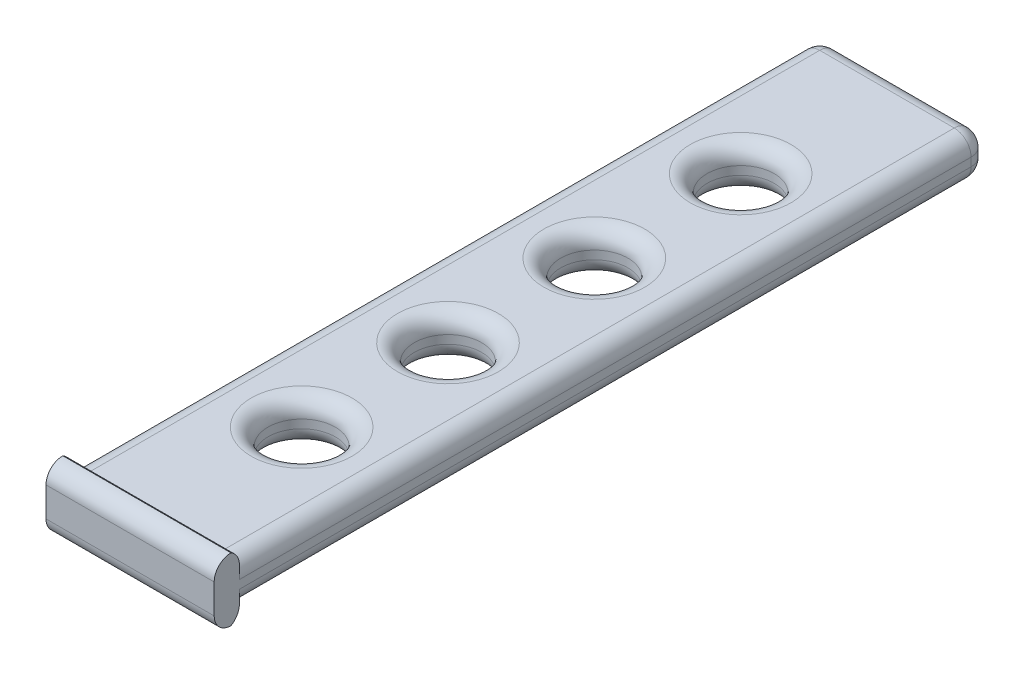
ISO-10303-21;
HEADER;
FILE_DESCRIPTION(('STEP AP214'),'2;1');
FILE_NAME('part.step','',(''),(''),'','','');
FILE_SCHEMA(('AUTOMOTIVE_DESIGN { 1 0 10303 214 1 1 1 1 }'));
ENDSEC;
DATA;
#1=APPLICATION_CONTEXT('core data for automotive mechanical design processes');
#2=APPLICATION_PROTOCOL_DEFINITION('international standard','automotive_design',2000,#1);
#3=PRODUCT_CONTEXT('',#1,'mechanical');
#4=PRODUCT('Part','Part','',(#3));
#5=PRODUCT_RELATED_PRODUCT_CATEGORY('part','',(#4));
#6=PRODUCT_DEFINITION_FORMATION('','',#4);
#7=PRODUCT_DEFINITION_CONTEXT('part definition',#1,'design');
#8=PRODUCT_DEFINITION('design','',#6,#7);
#9=PRODUCT_DEFINITION_SHAPE('','',#8);
#10=(LENGTH_UNIT() NAMED_UNIT(*) SI_UNIT(.MILLI.,.METRE.));
#11=(NAMED_UNIT(*) PLANE_ANGLE_UNIT() SI_UNIT($,.RADIAN.));
#12=(NAMED_UNIT(*) SI_UNIT($,.STERADIAN.) SOLID_ANGLE_UNIT());
#13=UNCERTAINTY_MEASURE_WITH_UNIT(LENGTH_MEASURE(1.E-05),#10,'distance_accuracy_value','');
#14=(GEOMETRIC_REPRESENTATION_CONTEXT(3) GLOBAL_UNCERTAINTY_ASSIGNED_CONTEXT((#13)) GLOBAL_UNIT_ASSIGNED_CONTEXT((#10,
#11,#12)) REPRESENTATION_CONTEXT('',''));
#15=CARTESIAN_POINT('',(0.,0.,0.));
#16=DIRECTION('',(0.,0.,1.));
#17=DIRECTION('',(1.,0.,0.));
#18=AXIS2_PLACEMENT_3D('',#15,#16,#17);
#19=CARTESIAN_POINT('',(0.,0.,0.));
#20=DIRECTION('',(0.,0.,1.));
#21=DIRECTION('',(1.,0.,0.));
#22=AXIS2_PLACEMENT_3D('',#19,#20,#21);
#23=PLANE('',#22);
#24=DIRECTION('',(0.,-1.,0.));
#25=VECTOR('',#24,1.);
#26=CARTESIAN_POINT('',(-12.7,7.93749999999999,0.));
#27=LINE('',#26,#25);
#28=CARTESIAN_POINT('',(-12.7,5.73779547438752,0.));
#29=VERTEX_POINT('',#28);
#30=CARTESIAN_POINT('',(-12.7,3.80999999999998,0.));
#31=VERTEX_POINT('',#30);
#32=EDGE_CURVE('E359',#29,#31,#27,.T.);
#33=ORIENTED_EDGE('',*,*,#32,.F.);
#34=DIRECTION('',(1.,0.,0.));
#35=VECTOR('',#34,1.);
#36=CARTESIAN_POINT('',(0.,5.73779547438752,0.));
#37=LINE('',#36,#35);
#38=CARTESIAN_POINT('',(-11.8138454005532,5.73779547438752,0.));
#39=VERTEX_POINT('',#38);
#40=EDGE_CURVE('E198',#29,#39,#37,.T.);
#41=ORIENTED_EDGE('',*,*,#40,.T.);
#42=CARTESIAN_POINT('',(-10.16,3.80999999999998,0.));
#43=DIRECTION('',(0.,0.,1.));
#44=DIRECTION('',(1.,0.,0.));
#45=AXIS2_PLACEMENT_3D('',#42,#43,#44);
#46=CIRCLE('',#45,2.54);
#47=EDGE_CURVE('E320',#39,#31,#46,.T.);
#48=ORIENTED_EDGE('',*,*,#47,.T.);
#49=EDGE_LOOP('',(#33,#41,#48));
#50=FACE_BOUND('',#49,.T.);
#51=ADVANCED_FACE('F48',(#50),#23,.F.);
#52=DIRECTION('',(0.,-1.,0.));
#53=VECTOR('',#52,1.);
#54=CARTESIAN_POINT('',(12.7,7.93749999999999,0.));
#55=LINE('',#54,#53);
#56=CARTESIAN_POINT('',(12.7000000000001,2.53999999999999,0.));
#57=VERTEX_POINT('',#56);
#58=CARTESIAN_POINT('',(12.7,0.612204525612503,0.));
#59=VERTEX_POINT('',#58);
#60=EDGE_CURVE('E358',#57,#59,#55,.T.);
#61=ORIENTED_EDGE('',*,*,#60,.T.);
#62=DIRECTION('',(1.,0.,0.));
#63=VECTOR('',#62,1.);
#64=CARTESIAN_POINT('',(0.,0.612204525612503,0.));
#65=LINE('',#64,#63);
#66=CARTESIAN_POINT('',(11.8138454005533,0.612204525612503,0.));
#67=VERTEX_POINT('',#66);
#68=EDGE_CURVE('E260',#59,#67,#65,.F.);
#69=ORIENTED_EDGE('',*,*,#68,.T.);
#70=CARTESIAN_POINT('',(10.1600000000001,2.53999999999999,0.));
#71=DIRECTION('',(0.,0.,1.));
#72=DIRECTION('',(1.,0.,0.));
#73=AXIS2_PLACEMENT_3D('',#70,#71,#72);
#74=CIRCLE('',#73,2.54);
#75=EDGE_CURVE('E315',#67,#57,#74,.T.);
#76=ORIENTED_EDGE('',*,*,#75,.T.);
#77=EDGE_LOOP('',(#61,#69,#76));
#78=FACE_BOUND('',#77,.T.);
#79=ADVANCED_FACE('F439',(#78),#23,.F.);
#80=CARTESIAN_POINT('',(12.7,6.34999999999997,-113.04072994228));
#81=DIRECTION('',(1.,0.,0.));
#82=DIRECTION('',(0.,0.,-1.));
#83=AXIS2_PLACEMENT_3D('',#80,#81,#82);
#84=PLANE('',#83);
#85=CARTESIAN_POINT('',(12.7000000000001,5.73779547438752,0.));
#86=VERTEX_POINT('',#85);
#87=CARTESIAN_POINT('',(12.7,3.80999999999998,0.));
#88=VERTEX_POINT('',#87);
#89=EDGE_CURVE('E356',#86,#88,#55,.T.);
#90=ORIENTED_EDGE('',*,*,#89,.F.);
#91=CARTESIAN_POINT('',(12.7000000000001,5.73779547438752,2.54));
#92=DIRECTION('',(1.,0.,0.));
#93=DIRECTION('',(0.,0.,-1.));
#94=AXIS2_PLACEMENT_3D('',#91,#92,#93);
#95=CIRCLE('',#94,2.54);
#96=CARTESIAN_POINT('',(12.7,7.93749999999999,1.27));
#97=VERTEX_POINT('',#96);
#98=EDGE_CURVE('E200',#86,#97,#95,.T.);
#99=ORIENTED_EDGE('',*,*,#98,.T.);
#100=CARTESIAN_POINT('',(12.7000000000001,5.3975,1.27));
#101=DIRECTION('',(1.,0.,0.));
#102=DIRECTION('',(0.,0.,-1.));
#103=AXIS2_PLACEMENT_3D('',#100,#101,#102);
#104=CIRCLE('',#103,2.54);
#105=CARTESIAN_POINT('',(12.7,5.3975,3.81));
#106=VERTEX_POINT('',#105);
#107=EDGE_CURVE('E190',#97,#106,#104,.T.);
#108=ORIENTED_EDGE('',*,*,#107,.T.);
#109=DIRECTION('',(0.,-1.,0.));
#110=VECTOR('',#109,1.);
#111=CARTESIAN_POINT('',(12.7,7.93749999999999,3.81));
#112=LINE('',#111,#110);
#113=CARTESIAN_POINT('',(12.7,0.952500000000023,3.81));
#114=VERTEX_POINT('',#113);
#115=EDGE_CURVE('E193',#106,#114,#112,.T.);
#116=ORIENTED_EDGE('',*,*,#115,.T.);
#117=CARTESIAN_POINT('',(12.7000000000001,0.952500000000023,1.27));
#118=DIRECTION('',(1.,0.,0.));
#119=DIRECTION('',(0.,0.,-1.));
#120=AXIS2_PLACEMENT_3D('',#117,#118,#119);
#121=CIRCLE('',#120,2.54);
#122=CARTESIAN_POINT('',(12.7,-1.58750000000002,1.27));
#123=VERTEX_POINT('',#122);
#124=EDGE_CURVE('E349',#114,#123,#121,.T.);
#125=ORIENTED_EDGE('',*,*,#124,.T.);
#126=CARTESIAN_POINT('',(12.7000000000001,0.612204525612503,2.54));
#127=DIRECTION('',(1.,0.,0.));
#128=DIRECTION('',(0.,0.,-1.));
#129=AXIS2_PLACEMENT_3D('',#126,#127,#128);
#130=CIRCLE('',#129,2.54);
#131=EDGE_CURVE('E264',#123,#59,#130,.T.);
#132=ORIENTED_EDGE('',*,*,#131,.T.);
#133=ORIENTED_EDGE('',*,*,#60,.F.);
#134=DIRECTION('',(0.,0.,1.));
#135=VECTOR('',#134,1.);
#136=CARTESIAN_POINT('',(12.7,2.53999999999999,-113.04072994228));
#137=LINE('',#136,#135);
#138=CARTESIAN_POINT('',(12.7,2.53999999999999,-110.50072994228));
#139=VERTEX_POINT('',#138);
#140=EDGE_CURVE('E341',#57,#139,#137,.F.);
#141=ORIENTED_EDGE('',*,*,#140,.T.);
#142=DIRECTION('',(0.,-1.,0.));
#143=VECTOR('',#142,1.);
#144=CARTESIAN_POINT('',(12.7,6.34999999999997,-110.50072994228));
#145=LINE('',#144,#143);
#146=CARTESIAN_POINT('',(12.7,3.80999999999998,-110.50072994228));
#147=VERTEX_POINT('',#146);
#148=EDGE_CURVE('E297',#139,#147,#145,.F.);
#149=ORIENTED_EDGE('',*,*,#148,.T.);
#150=DIRECTION('',(0.,0.,1.));
#151=VECTOR('',#150,1.);
#152=CARTESIAN_POINT('',(12.7,3.80999999999998,-113.04072994228));
#153=LINE('',#152,#151);
#154=EDGE_CURVE('E338',#147,#88,#153,.T.);
#155=ORIENTED_EDGE('',*,*,#154,.T.);
#156=EDGE_LOOP('',(#90,#99,#108,#116,#125,#132,#133,#141,#149,#155));
#157=FACE_BOUND('',#156,.T.);
#158=ADVANCED_FACE('F373',(#157),#84,.T.);
#159=CARTESIAN_POINT('',(-12.7,6.34999999999997,-113.04072994228));
#160=DIRECTION('',(0.,0.,-1.));
#161=DIRECTION('',(-1.,0.,0.));
#162=AXIS2_PLACEMENT_3D('',#159,#160,#161);
#163=PLANE('',#162);
#164=DIRECTION('',(0.,-1.,0.));
#165=VECTOR('',#164,1.);
#166=CARTESIAN_POINT('',(10.16,6.34999999999997,-113.04072994228));
#167=LINE('',#166,#165);
#168=CARTESIAN_POINT('',(10.16,3.80999999999998,-113.04072994228));
#169=VERTEX_POINT('',#168);
#170=CARTESIAN_POINT('',(10.16,2.53999999999999,-113.04072994228));
#171=VERTEX_POINT('',#170);
#172=EDGE_CURVE('E306',#169,#171,#167,.T.);
#173=ORIENTED_EDGE('',*,*,#172,.T.);
#174=DIRECTION('',(1.,0.,0.));
#175=VECTOR('',#174,1.);
#176=CARTESIAN_POINT('',(-10.16,2.53999999999999,-113.04072994228));
#177=LINE('',#176,#175);
#178=CARTESIAN_POINT('',(-10.16,2.53999999999999,-113.04072994228));
#179=VERTEX_POINT('',#178);
#180=EDGE_CURVE('E301',#171,#179,#177,.F.);
#181=ORIENTED_EDGE('',*,*,#180,.T.);
#182=DIRECTION('',(0.,-1.,0.));
#183=VECTOR('',#182,1.);
#184=CARTESIAN_POINT('',(-10.16,6.34999999999997,-113.04072994228));
#185=LINE('',#184,#183);
#186=CARTESIAN_POINT('',(-10.16,3.80999999999998,-113.04072994228));
#187=VERTEX_POINT('',#186);
#188=EDGE_CURVE('E303',#179,#187,#185,.F.);
#189=ORIENTED_EDGE('',*,*,#188,.T.);
#190=DIRECTION('',(1.,0.,0.));
#191=VECTOR('',#190,1.);
#192=CARTESIAN_POINT('',(-12.7,3.80999999999998,-113.04072994228));
#193=LINE('',#192,#191);
#194=EDGE_CURVE('E308',#187,#169,#193,.T.);
#195=ORIENTED_EDGE('',*,*,#194,.T.);
#196=EDGE_LOOP('',(#173,#181,#189,#195));
#197=FACE_BOUND('',#196,.T.);
#198=ADVANCED_FACE('F401',(#197),#163,.T.);
#199=CARTESIAN_POINT('',(-12.7,6.34999999999997,-67.3207299422797));
#200=DIRECTION('',(-1.,0.,0.));
#201=DIRECTION('',(0.,0.,1.));
#202=AXIS2_PLACEMENT_3D('',#199,#200,#201);
#203=PLANE('',#202);
#204=CARTESIAN_POINT('',(-12.7,5.3975,1.27));
#205=DIRECTION('',(-1.,0.,0.));
#206=DIRECTION('',(0.,0.,1.));
#207=AXIS2_PLACEMENT_3D('',#204,#205,#206);
#208=CIRCLE('',#207,2.54);
#209=CARTESIAN_POINT('',(-12.7,5.3975,3.81));
#210=VERTEX_POINT('',#209);
#211=CARTESIAN_POINT('',(-12.7,7.93749999999999,1.27));
#212=VERTEX_POINT('',#211);
#213=EDGE_CURVE('E173',#210,#212,#208,.T.);
#214=ORIENTED_EDGE('',*,*,#213,.T.);
#215=CARTESIAN_POINT('',(-12.7,5.73779547438752,2.54));
#216=DIRECTION('',(-1.,0.,0.));
#217=DIRECTION('',(0.,0.,1.));
#218=AXIS2_PLACEMENT_3D('',#215,#216,#217);
#219=CIRCLE('',#218,2.54);
#220=EDGE_CURVE('E177',#212,#29,#219,.T.);
#221=ORIENTED_EDGE('',*,*,#220,.T.);
#222=ORIENTED_EDGE('',*,*,#32,.T.);
#223=DIRECTION('',(0.,0.,1.));
#224=VECTOR('',#223,1.);
#225=CARTESIAN_POINT('',(-12.7,3.80999999999998,-67.3207299422797));
#226=LINE('',#225,#224);
#227=CARTESIAN_POINT('',(-12.7,3.80999999999998,-110.50072994228));
#228=VERTEX_POINT('',#227);
#229=EDGE_CURVE('E331',#31,#228,#226,.F.);
#230=ORIENTED_EDGE('',*,*,#229,.T.);
#231=DIRECTION('',(0.,-1.,0.));
#232=VECTOR('',#231,1.);
#233=CARTESIAN_POINT('',(-12.7,6.34999999999997,-110.50072994228));
#234=LINE('',#233,#232);
#235=CARTESIAN_POINT('',(-12.7,2.53999999999999,-110.50072994228));
#236=VERTEX_POINT('',#235);
#237=EDGE_CURVE('E310',#228,#236,#234,.T.);
#238=ORIENTED_EDGE('',*,*,#237,.T.);
#239=DIRECTION('',(0.,0.,-1.));
#240=VECTOR('',#239,1.);
#241=CARTESIAN_POINT('',(-12.7,2.53999999999999,0.));
#242=LINE('',#241,#240);
#243=CARTESIAN_POINT('',(-12.7,2.53999999999999,0.));
#244=VERTEX_POINT('',#243);
#245=EDGE_CURVE('E334',#236,#244,#242,.F.);
#246=ORIENTED_EDGE('',*,*,#245,.T.);
#247=CARTESIAN_POINT('',(-12.7,0.612204525612503,0.));
#248=VERTEX_POINT('',#247);
#249=EDGE_CURVE('E270',#244,#248,#27,.T.);
#250=ORIENTED_EDGE('',*,*,#249,.T.);
#251=CARTESIAN_POINT('',(-12.7,0.612204525612503,2.54));
#252=DIRECTION('',(-1.,0.,0.));
#253=DIRECTION('',(0.,0.,1.));
#254=AXIS2_PLACEMENT_3D('',#251,#252,#253);
#255=CIRCLE('',#254,2.54);
#256=CARTESIAN_POINT('',(-12.7,-1.58750000000002,1.27));
#257=VERTEX_POINT('',#256);
#258=EDGE_CURVE('E258',#248,#257,#255,.T.);
#259=ORIENTED_EDGE('',*,*,#258,.T.);
#260=CARTESIAN_POINT('',(-12.7,0.952500000000023,1.27));
#261=DIRECTION('',(-1.,0.,0.));
#262=DIRECTION('',(0.,0.,1.));
#263=AXIS2_PLACEMENT_3D('',#260,#261,#262);
#264=CIRCLE('',#263,2.54);
#265=CARTESIAN_POINT('',(-12.7,0.952500000000023,3.81));
#266=VERTEX_POINT('',#265);
#267=EDGE_CURVE('E344',#257,#266,#264,.T.);
#268=ORIENTED_EDGE('',*,*,#267,.T.);
#269=DIRECTION('',(0.,-1.,0.));
#270=VECTOR('',#269,1.);
#271=CARTESIAN_POINT('',(-12.7,7.93749999999999,3.81));
#272=LINE('',#271,#270);
#273=EDGE_CURVE('E180',#210,#266,#272,.T.);
#274=ORIENTED_EDGE('',*,*,#273,.F.);
#275=EDGE_LOOP('',(#214,#221,#222,#230,#238,#246,#250,#259,#268,#274));
#276=FACE_BOUND('',#275,.T.);
#277=ADVANCED_FACE('F175',(#276),#203,.T.);
#278=CARTESIAN_POINT('',(0.,6.34999999999997,0.));
#279=DIRECTION('',(0.,1.,0.));
#280=DIRECTION('',(0.,0.,1.));
#281=AXIS2_PLACEMENT_3D('',#278,#279,#280);
#282=PLANE('',#281);
#283=CARTESIAN_POINT('',(0.,6.34999999999997,-22.1001459884559));
#284=DIRECTION('',(0.,1.,0.));
#285=DIRECTION('',(0.,0.,1.));
#286=AXIS2_PLACEMENT_3D('',#283,#284,#285);
#287=CIRCLE('',#286,7.62);
#288=CARTESIAN_POINT('',(0.,6.34999999999997,-14.4801459884559));
#289=VERTEX_POINT('',#288);
#290=EDGE_CURVE('E684',#289,#289,#287,.F.);
#291=ORIENTED_EDGE('',*,*,#290,.T.);
#292=EDGE_LOOP('',(#291));
#293=FACE_BOUND('',#292,.T.);
#294=CARTESIAN_POINT('',(0.,6.34999999999997,-44.2002919769119));
#295=DIRECTION('',(0.,1.,0.));
#296=DIRECTION('',(0.,0.,1.));
#297=AXIS2_PLACEMENT_3D('',#294,#295,#296);
#298=CIRCLE('',#297,7.62);
#299=CARTESIAN_POINT('',(0.,6.34999999999997,-36.5802919769119));
#300=VERTEX_POINT('',#299);
#301=EDGE_CURVE('E686',#300,#300,#298,.F.);
#302=ORIENTED_EDGE('',*,*,#301,.T.);
#303=EDGE_LOOP('',(#302));
#304=FACE_BOUND('',#303,.T.);
#305=CARTESIAN_POINT('',(0.,6.34999999999997,-66.3004379653678));
#306=DIRECTION('',(0.,1.,0.));
#307=DIRECTION('',(0.,0.,1.));
#308=AXIS2_PLACEMENT_3D('',#305,#306,#307);
#309=CIRCLE('',#308,7.62);
#310=CARTESIAN_POINT('',(0.,6.34999999999997,-58.6804379653678));
#311=VERTEX_POINT('',#310);
#312=EDGE_CURVE('E691',#311,#311,#309,.F.);
#313=ORIENTED_EDGE('',*,*,#312,.T.);
#314=EDGE_LOOP('',(#313));
#315=FACE_BOUND('',#314,.T.);
#316=CARTESIAN_POINT('',(0.,6.34999999999997,-88.4005839538237));
#317=DIRECTION('',(0.,1.,0.));
#318=DIRECTION('',(0.,0.,1.));
#319=AXIS2_PLACEMENT_3D('',#316,#317,#318);
#320=CIRCLE('',#319,7.62);
#321=CARTESIAN_POINT('',(0.,6.34999999999997,-80.7805839538237));
#322=VERTEX_POINT('',#321);
#323=EDGE_CURVE('E694',#322,#322,#320,.F.);
#324=ORIENTED_EDGE('',*,*,#323,.T.);
#325=EDGE_LOOP('',(#324));
#326=FACE_BOUND('',#325,.T.);
#327=DIRECTION('',(0.,0.,1.));
#328=VECTOR('',#327,1.);
#329=CARTESIAN_POINT('',(10.1600000000001,6.34999999999997,0.));
#330=LINE('',#329,#328);
#331=CARTESIAN_POINT('',(10.1600000000001,6.34999999999997,0.0748822302332882));
#332=VERTEX_POINT('',#331);
#333=CARTESIAN_POINT('',(10.16,6.34999999999997,-110.50072994228));
#334=VERTEX_POINT('',#333);
#335=EDGE_CURVE('E63',#332,#334,#330,.F.);
#336=ORIENTED_EDGE('',*,*,#335,.T.);
#337=DIRECTION('',(1.,0.,0.));
#338=VECTOR('',#337,1.);
#339=CARTESIAN_POINT('',(0.,6.34999999999997,-110.50072994228));
#340=LINE('',#339,#338);
#341=CARTESIAN_POINT('',(-10.16,6.34999999999997,-110.50072994228));
#342=VERTEX_POINT('',#341);
#343=EDGE_CURVE('E266',#334,#342,#340,.F.);
#344=ORIENTED_EDGE('',*,*,#343,.T.);
#345=DIRECTION('',(0.,0.,1.));
#346=VECTOR('',#345,1.);
#347=CARTESIAN_POINT('',(-10.16,6.34999999999997,0.));
#348=LINE('',#347,#346);
#349=CARTESIAN_POINT('',(-10.16,6.34999999999997,0.0748822302332882));
#350=VERTEX_POINT('',#349);
#351=EDGE_CURVE('E70',#342,#350,#348,.T.);
#352=ORIENTED_EDGE('',*,*,#351,.T.);
#353=DIRECTION('',(1.,0.,0.));
#354=VECTOR('',#353,1.);
#355=CARTESIAN_POINT('',(-10.16,6.34999999999997,0.0748822302332882));
#356=LINE('',#355,#354);
#357=EDGE_CURVE('E202',#350,#332,#356,.T.);
#358=ORIENTED_EDGE('',*,*,#357,.T.);
#359=EDGE_LOOP('',(#336,#344,#352,#358));
#360=FACE_BOUND('',#359,.T.);
#361=ADVANCED_FACE('F445',(#293,#304,#315,#326,#360),#282,.T.);
#362=CARTESIAN_POINT('',(0.,0.,0.));
#363=DIRECTION('',(0.,1.,0.));
#364=DIRECTION('',(0.,0.,1.));
#365=AXIS2_PLACEMENT_3D('',#362,#363,#364);
#366=PLANE('',#365);
#367=CARTESIAN_POINT('',(0.,0.,-22.1001459884559));
#368=DIRECTION('',(0.,1.,0.));
#369=DIRECTION('',(0.,0.,1.));
#370=AXIS2_PLACEMENT_3D('',#367,#368,#369);
#371=CIRCLE('',#370,7.62);
#372=CARTESIAN_POINT('',(0.,0.,-14.4801459884559));
#373=VERTEX_POINT('',#372);
#374=EDGE_CURVE('E667',#373,#373,#371,.T.);
#375=ORIENTED_EDGE('',*,*,#374,.T.);
#376=EDGE_LOOP('',(#375));
#377=FACE_BOUND('',#376,.T.);
#378=CARTESIAN_POINT('',(0.,0.,-44.2002919769119));
#379=DIRECTION('',(0.,1.,0.));
#380=DIRECTION('',(0.,0.,1.));
#381=AXIS2_PLACEMENT_3D('',#378,#379,#380);
#382=CIRCLE('',#381,7.62);
#383=CARTESIAN_POINT('',(0.,0.,-36.5802919769119));
#384=VERTEX_POINT('',#383);
#385=EDGE_CURVE('E664',#384,#384,#382,.T.);
#386=ORIENTED_EDGE('',*,*,#385,.T.);
#387=EDGE_LOOP('',(#386));
#388=FACE_BOUND('',#387,.T.);
#389=CARTESIAN_POINT('',(0.,0.,-66.3004379653678));
#390=DIRECTION('',(0.,1.,0.));
#391=DIRECTION('',(0.,0.,1.));
#392=AXIS2_PLACEMENT_3D('',#389,#390,#391);
#393=CIRCLE('',#392,7.62);
#394=CARTESIAN_POINT('',(0.,0.,-58.6804379653678));
#395=VERTEX_POINT('',#394);
#396=EDGE_CURVE('E661',#395,#395,#393,.T.);
#397=ORIENTED_EDGE('',*,*,#396,.T.);
#398=EDGE_LOOP('',(#397));
#399=FACE_BOUND('',#398,.T.);
#400=CARTESIAN_POINT('',(0.,0.,-88.4005839538237));
#401=DIRECTION('',(0.,1.,0.));
#402=DIRECTION('',(0.,0.,1.));
#403=AXIS2_PLACEMENT_3D('',#400,#401,#402);
#404=CIRCLE('',#403,7.62);
#405=CARTESIAN_POINT('',(0.,0.,-80.7805839538237));
#406=VERTEX_POINT('',#405);
#407=EDGE_CURVE('E643',#406,#406,#404,.T.);
#408=ORIENTED_EDGE('',*,*,#407,.T.);
#409=EDGE_LOOP('',(#408));
#410=FACE_BOUND('',#409,.T.);
#411=DIRECTION('',(0.,0.,-1.));
#412=VECTOR('',#411,1.);
#413=CARTESIAN_POINT('',(-10.16,0.,-113.04072994228));
#414=LINE('',#413,#412);
#415=CARTESIAN_POINT('',(-10.16,0.,0.0748822302332882));
#416=VERTEX_POINT('',#415);
#417=CARTESIAN_POINT('',(-10.16,0.,-110.50072994228));
#418=VERTEX_POINT('',#417);
#419=EDGE_CURVE('E326',#416,#418,#414,.T.);
#420=ORIENTED_EDGE('',*,*,#419,.T.);
#421=DIRECTION('',(1.,0.,0.));
#422=VECTOR('',#421,1.);
#423=CARTESIAN_POINT('',(10.16,0.,-110.50072994228));
#424=LINE('',#423,#422);
#425=CARTESIAN_POINT('',(10.16,0.,-110.50072994228));
#426=VERTEX_POINT('',#425);
#427=EDGE_CURVE('E293',#418,#426,#424,.T.);
#428=ORIENTED_EDGE('',*,*,#427,.T.);
#429=DIRECTION('',(0.,0.,1.));
#430=VECTOR('',#429,1.);
#431=CARTESIAN_POINT('',(10.1600000000001,0.,0.));
#432=LINE('',#431,#430);
#433=CARTESIAN_POINT('',(10.1600000000001,0.,0.0748822302332882));
#434=VERTEX_POINT('',#433);
#435=EDGE_CURVE('E329',#426,#434,#432,.T.);
#436=ORIENTED_EDGE('',*,*,#435,.T.);
#437=DIRECTION('',(1.,0.,0.));
#438=VECTOR('',#437,1.);
#439=CARTESIAN_POINT('',(10.1600000000001,0.,0.0748822302332882));
#440=LINE('',#439,#438);
#441=EDGE_CURVE('E241',#434,#416,#440,.F.);
#442=ORIENTED_EDGE('',*,*,#441,.T.);
#443=EDGE_LOOP('',(#420,#428,#436,#442));
#444=FACE_BOUND('',#443,.T.);
#445=ADVANCED_FACE('F410',(#377,#388,#399,#410,#444),#366,.F.);
#446=CARTESIAN_POINT('',(-10.16,2.53999999999999,0.));
#447=DIRECTION('',(0.,0.,1.));
#448=DIRECTION('',(1.,0.,0.));
#449=AXIS2_PLACEMENT_3D('',#446,#447,#448);
#450=CIRCLE('',#449,2.54);
#451=CARTESIAN_POINT('',(-11.8138454005532,0.612204525612503,0.));
#452=VERTEX_POINT('',#451);
#453=EDGE_CURVE('E317',#244,#452,#450,.T.);
#454=ORIENTED_EDGE('',*,*,#453,.T.);
#455=DIRECTION('',(1.,0.,0.));
#456=VECTOR('',#455,1.);
#457=CARTESIAN_POINT('',(0.,0.612204525612503,0.));
#458=LINE('',#457,#456);
#459=EDGE_CURVE('E262',#452,#248,#458,.F.);
#460=ORIENTED_EDGE('',*,*,#459,.T.);
#461=ORIENTED_EDGE('',*,*,#249,.F.);
#462=EDGE_LOOP('',(#454,#460,#461));
#463=FACE_BOUND('',#462,.T.);
#464=ADVANCED_FACE('F430',(#463),#23,.F.);
#465=CARTESIAN_POINT('',(0.,0.,3.81));
#466=DIRECTION('',(0.,0.,1.));
#467=DIRECTION('',(1.,0.,0.));
#468=AXIS2_PLACEMENT_3D('',#465,#466,#467);
#469=PLANE('',#468);
#470=ORIENTED_EDGE('',*,*,#273,.T.);
#471=DIRECTION('',(1.,0.,0.));
#472=VECTOR('',#471,1.);
#473=CARTESIAN_POINT('',(12.7,0.952500000000023,3.81));
#474=LINE('',#473,#472);
#475=EDGE_CURVE('E183',#266,#114,#474,.T.);
#476=ORIENTED_EDGE('',*,*,#475,.T.);
#477=ORIENTED_EDGE('',*,*,#115,.F.);
#478=DIRECTION('',(1.,0.,0.));
#479=VECTOR('',#478,1.);
#480=CARTESIAN_POINT('',(0.,5.3975,3.81));
#481=LINE('',#480,#479);
#482=EDGE_CURVE('E184',#106,#210,#481,.F.);
#483=ORIENTED_EDGE('',*,*,#482,.T.);
#484=EDGE_LOOP('',(#470,#476,#477,#483));
#485=FACE_BOUND('',#484,.T.);
#486=ADVANCED_FACE('F365',(#485),#469,.T.);
#487=CARTESIAN_POINT('',(10.1600000000001,3.80999999999998,0.));
#488=DIRECTION('',(0.,0.,1.));
#489=DIRECTION('',(1.,0.,0.));
#490=AXIS2_PLACEMENT_3D('',#487,#488,#489);
#491=CIRCLE('',#490,2.54);
#492=CARTESIAN_POINT('',(11.8138454005533,5.73779547438752,0.));
#493=VERTEX_POINT('',#492);
#494=EDGE_CURVE('E323',#88,#493,#491,.T.);
#495=ORIENTED_EDGE('',*,*,#494,.T.);
#496=DIRECTION('',(1.,0.,0.));
#497=VECTOR('',#496,1.);
#498=CARTESIAN_POINT('',(0.,5.73779547438752,0.));
#499=LINE('',#498,#497);
#500=EDGE_CURVE('E240',#493,#86,#499,.T.);
#501=ORIENTED_EDGE('',*,*,#500,.T.);
#502=ORIENTED_EDGE('',*,*,#89,.T.);
#503=EDGE_LOOP('',(#495,#501,#502));
#504=FACE_BOUND('',#503,.T.);
#505=ADVANCED_FACE('F427',(#504),#23,.F.);
#506=CARTESIAN_POINT('',(-12.7,5.3975,1.27));
#507=DIRECTION('',(1.,0.,0.));
#508=DIRECTION('',(0.,0.,-1.));
#509=AXIS2_PLACEMENT_3D('',#506,#507,#508);
#510=CYLINDRICAL_SURFACE('',#509,2.54);
#511=ORIENTED_EDGE('',*,*,#213,.F.);
#512=ORIENTED_EDGE('',*,*,#482,.F.);
#513=ORIENTED_EDGE('',*,*,#107,.F.);
#514=DIRECTION('',(1.,0.,0.));
#515=VECTOR('',#514,1.);
#516=CARTESIAN_POINT('',(-12.7,7.93749999999999,1.27));
#517=LINE('',#516,#515);
#518=EDGE_CURVE('E188',#212,#97,#517,.T.);
#519=ORIENTED_EDGE('',*,*,#518,.F.);
#520=EDGE_LOOP('',(#511,#512,#513,#519));
#521=FACE_BOUND('',#520,.T.);
#522=ADVANCED_FACE('F189',(#521),#510,.T.);
#523=CARTESIAN_POINT('',(0.,0.952500000000023,1.27));
#524=DIRECTION('',(-1.,0.,0.));
#525=DIRECTION('',(0.,0.,1.));
#526=AXIS2_PLACEMENT_3D('',#523,#524,#525);
#527=CYLINDRICAL_SURFACE('',#526,2.54);
#528=ORIENTED_EDGE('',*,*,#267,.F.);
#529=DIRECTION('',(1.,0.,0.));
#530=VECTOR('',#529,1.);
#531=CARTESIAN_POINT('',(-12.7,-1.58750000000002,1.27));
#532=LINE('',#531,#530);
#533=EDGE_CURVE('E346',#123,#257,#532,.F.);
#534=ORIENTED_EDGE('',*,*,#533,.F.);
#535=ORIENTED_EDGE('',*,*,#124,.F.);
#536=ORIENTED_EDGE('',*,*,#475,.F.);
#537=EDGE_LOOP('',(#528,#534,#535,#536));
#538=FACE_BOUND('',#537,.T.);
#539=ADVANCED_FACE('F369',(#538),#527,.T.);
#540=CARTESIAN_POINT('',(10.16,3.80999999999998,-113.04072994228));
#541=DIRECTION('',(0.,0.,1.));
#542=DIRECTION('',(1.,0.,0.));
#543=AXIS2_PLACEMENT_3D('',#540,#541,#542);
#544=CYLINDRICAL_SURFACE('',#543,2.54);
#545=ORIENTED_EDGE('',*,*,#154,.F.);
#546=CARTESIAN_POINT('',(10.16,3.80999999999998,-110.50072994228));
#547=DIRECTION('',(0.,0.,1.));
#548=DIRECTION('',(1.,0.,0.));
#549=AXIS2_PLACEMENT_3D('',#546,#547,#548);
#550=CIRCLE('',#549,2.54);
#551=EDGE_CURVE('E295',#147,#334,#550,.T.);
#552=ORIENTED_EDGE('',*,*,#551,.T.);
#553=ORIENTED_EDGE('',*,*,#335,.F.);
#554=CARTESIAN_POINT('',(10.1600000000001,6.34999999999997,0.0748822302332882));
#555=CARTESIAN_POINT('',(10.230945182168,6.35000818471926,0.0749077451127343));
#556=CARTESIAN_POINT('',(10.3018831544188,6.34702785933484,0.0741446206322667));
#557=CARTESIAN_POINT('',(10.4432173857556,6.3351544305761,0.0712290185604482));
#558=CARTESIAN_POINT('',(10.5136137713526,6.32626275326688,0.0690768760619453));
#559=CARTESIAN_POINT('',(10.6535122028889,6.3026071403371,0.0635654811701414));
#560=CARTESIAN_POINT('',(10.7230121752171,6.28783147916046,0.0602038197557274));
#561=CARTESIAN_POINT('',(10.8604725228664,6.25253501306286,0.0526387389030429));
#562=CARTESIAN_POINT('',(10.9284328894715,6.23201417562616,0.0484353147007195));
#563=CARTESIAN_POINT('',(11.1293110071284,6.16204543768031,0.0352248360312226));
#564=CARTESIAN_POINT('',(11.2593479758832,6.1041704765425,0.0256113729497434));
#565=CARTESIAN_POINT('',(11.507709475166,5.96760560618927,0.00949382119655786));
#566=CARTESIAN_POINT('',(11.6260734748168,5.88898939291809,0.00297894817572269));
#567=CARTESIAN_POINT('',(11.7630349954908,5.78053139593454,0.000276483043490205));
#568=CARTESIAN_POINT('',(11.7886567198464,5.75940959431915,1.06648491488918E-06));
#569=CARTESIAN_POINT('',(11.8138454005533,5.73779547438752,0.));
#570=B_SPLINE_CURVE_WITH_KNOTS('',3,(#554,#555,#556,#557,#558,#559,#560,#561,#562,#563,#564,
#565,#566,#567,#568,#569),.UNSPECIFIED.,.F.,.F.,(4,2,2,2,2,2,2,4),(0.,0.212756765089633,
0.425462222971848,0.638593696947823,0.851726377199872,1.27762411303231,1.70202850418737,
1.80161968126589),.UNSPECIFIED.);
#571=EDGE_CURVE('E379',#332,#493,#570,.T.);
#572=ORIENTED_EDGE('',*,*,#571,.T.);
#573=ORIENTED_EDGE('',*,*,#494,.F.);
#574=EDGE_LOOP('',(#545,#552,#553,#572,#573));
#575=FACE_BOUND('',#574,.T.);
#576=ADVANCED_FACE('F222',(#575),#544,.T.);
#577=CARTESIAN_POINT('',(-10.16,3.80999999999998,0.));
#578=DIRECTION('',(0.,0.,1.));
#579=DIRECTION('',(1.,0.,0.));
#580=AXIS2_PLACEMENT_3D('',#577,#578,#579);
#581=CYLINDRICAL_SURFACE('',#580,2.54);
#582=ORIENTED_EDGE('',*,*,#351,.F.);
#583=CARTESIAN_POINT('',(-10.16,3.80999999999998,-110.50072994228));
#584=DIRECTION('',(0.,0.,1.));
#585=DIRECTION('',(1.,0.,0.));
#586=AXIS2_PLACEMENT_3D('',#583,#584,#585);
#587=CIRCLE('',#586,2.54);
#588=EDGE_CURVE('E312',#342,#228,#587,.T.);
#589=ORIENTED_EDGE('',*,*,#588,.T.);
#590=ORIENTED_EDGE('',*,*,#229,.F.);
#591=ORIENTED_EDGE('',*,*,#47,.F.);
#592=CARTESIAN_POINT('',(-11.8138454005532,5.73779547438752,0.));
#593=CARTESIAN_POINT('',(-11.760035516222,5.78396786117079,5.57092557491934E-06));
#594=CARTESIAN_POINT('',(-11.7043031687964,5.82785943524972,0.00125892384055656));
#595=CARTESIAN_POINT('',(-11.5894339358792,5.91079175659,0.00555673998519226));
#596=CARTESIAN_POINT('',(-11.5302984047162,5.94983441425371,0.00860049509388544));
#597=CARTESIAN_POINT('',(-11.4088793820624,6.02290124813997,0.0157840979254494));
#598=CARTESIAN_POINT('',(-11.3465889088785,6.0569135772844,0.0199264709640155));
#599=CARTESIAN_POINT('',(-11.2194331981504,6.11959656708661,0.0286609756622313));
#600=CARTESIAN_POINT('',(-11.1545678364759,6.14826696984057,0.0332531290205831));
#601=CARTESIAN_POINT('',(-10.9567047695879,6.2259616201027,0.046787867270025));
#602=CARTESIAN_POINT('',(-10.8202925910277,6.26675793060903,0.0555003074616493));
#603=CARTESIAN_POINT('',(-10.6122968902969,6.31041207098163,0.0653469270935214));
#604=CARTESIAN_POINT('',(-10.5424784097608,6.32203697638371,0.0680909101368441));
#605=CARTESIAN_POINT('',(-10.4020812041297,6.33942365601297,0.0722620290446093));
#606=CARTESIAN_POINT('',(-10.3315030196576,6.34518935275494,0.0736900458380832));
#607=CARTESIAN_POINT('',(-10.2440310079571,6.34866548518099,0.0745512754404398));
#608=CARTESIAN_POINT('',(-10.2272239784466,6.34916602922869,0.074675314023057));
#609=CARTESIAN_POINT('',(-10.1936119078181,6.3498330970401,0.0748406902144099));
#610=CARTESIAN_POINT('',(-10.1768068704745,6.34999979993927,0.0748820721757402));
#611=CARTESIAN_POINT('',(-10.16,6.34999999999997,0.0748822302332796));
#612=B_SPLINE_CURVE_WITH_KNOTS('',3,(#592,#593,#594,#595,#596,#597,#598,#599,#600,#601,#602,
#603,#604,#605,#606,#607,#608,#609,#610,#611),.UNSPECIFIED.,.F.,.F.,(4,2,2,2,2,2,2,2,2,4),(0.,
0.212600574930854,0.425117120812314,0.638126462219586,0.851146084879142,1.27667398232284,
1.48898513449026,1.70115405868724,1.75159720080492,1.80201326843211),.UNSPECIFIED.);
#613=EDGE_CURVE('E199',#39,#350,#612,.T.);
#614=ORIENTED_EDGE('',*,*,#613,.T.);
#615=EDGE_LOOP('',(#582,#589,#590,#591,#614));
#616=FACE_BOUND('',#615,.T.);
#617=ADVANCED_FACE('F216',(#616),#581,.T.);
#618=CARTESIAN_POINT('',(-10.16,2.53999999999999,0.));
#619=DIRECTION('',(0.,0.,1.));
#620=DIRECTION('',(1.,0.,0.));
#621=AXIS2_PLACEMENT_3D('',#618,#619,#620);
#622=CYLINDRICAL_SURFACE('',#621,2.54);
#623=ORIENTED_EDGE('',*,*,#245,.F.);
#624=CARTESIAN_POINT('',(-10.16,2.53999999999999,-110.50072994228));
#625=DIRECTION('',(0.,0.,1.));
#626=DIRECTION('',(1.,0.,0.));
#627=AXIS2_PLACEMENT_3D('',#624,#625,#626);
#628=CIRCLE('',#627,2.54);
#629=EDGE_CURVE('E291',#236,#418,#628,.T.);
#630=ORIENTED_EDGE('',*,*,#629,.T.);
#631=ORIENTED_EDGE('',*,*,#419,.F.);
#632=CARTESIAN_POINT('',(-10.16,0.,0.0748822302332882));
#633=CARTESIAN_POINT('',(-10.2309451821679,-8.18471929060348E-06,0.0749077451127432));
#634=CARTESIAN_POINT('',(-10.3018831544187,0.00297214066512303,0.0741446206322788));
#635=CARTESIAN_POINT('',(-10.4432173857555,0.0148455694238695,0.0712290185604623));
#636=CARTESIAN_POINT('',(-10.5136137713525,0.0237372467330804,0.0690768760619582));
#637=CARTESIAN_POINT('',(-10.6535122028889,0.0473928596628608,0.0635654811701546));
#638=CARTESIAN_POINT('',(-10.7230121752171,0.0621685208395099,0.060203819755742));
#639=CARTESIAN_POINT('',(-10.8604725228664,0.0974649869371084,0.0526387389030523));
#640=CARTESIAN_POINT('',(-10.9284328894714,0.117985824373802,0.0484353147007223));
#641=CARTESIAN_POINT('',(-11.1293110071283,0.187954562319658,0.0352248360312171));
#642=CARTESIAN_POINT('',(-11.2593479758831,0.245829523457485,0.0256113729497478));
#643=CARTESIAN_POINT('',(-11.507709475166,0.382394393810693,0.00949382119656501));
#644=CARTESIAN_POINT('',(-11.6260734748167,0.461010607081844,0.00297894817572246));
#645=CARTESIAN_POINT('',(-11.7630349954907,0.569468604065442,0.000276483043489));
#646=CARTESIAN_POINT('',(-11.7886567198464,0.590590405680851,1.06648491389251E-06));
#647=CARTESIAN_POINT('',(-11.8138454005532,0.612204525612503,0.));
#648=B_SPLINE_CURVE_WITH_KNOTS('',3,(#632,#633,#634,#635,#636,#637,#638,#639,#640,#641,#642,
#643,#644,#645,#646,#647),.UNSPECIFIED.,.F.,.F.,(4,2,2,2,2,2,2,4),(0.,0.212756765089613,
0.425462222971813,0.6385936969478,0.851726377199858,1.27762411303231,1.70202850418736,
1.80161968126591),.UNSPECIFIED.);
#649=EDGE_CURVE('E234',#416,#452,#648,.T.);
#650=ORIENTED_EDGE('',*,*,#649,.T.);
#651=ORIENTED_EDGE('',*,*,#453,.F.);
#652=EDGE_LOOP('',(#623,#630,#631,#650,#651));
#653=FACE_BOUND('',#652,.T.);
#654=ADVANCED_FACE('F221',(#653),#622,.T.);
#655=CARTESIAN_POINT('',(10.1600000000001,2.53999999999999,0.));
#656=DIRECTION('',(0.,0.,-1.));
#657=DIRECTION('',(-1.,0.,0.));
#658=AXIS2_PLACEMENT_3D('',#655,#656,#657);
#659=CYLINDRICAL_SURFACE('',#658,2.54);
#660=ORIENTED_EDGE('',*,*,#435,.F.);
#661=CARTESIAN_POINT('',(10.16,2.53999999999999,-110.50072994228));
#662=DIRECTION('',(0.,0.,-1.));
#663=DIRECTION('',(-1.,0.,0.));
#664=AXIS2_PLACEMENT_3D('',#661,#662,#663);
#665=CIRCLE('',#664,2.54);
#666=EDGE_CURVE('E299',#426,#139,#665,.F.);
#667=ORIENTED_EDGE('',*,*,#666,.T.);
#668=ORIENTED_EDGE('',*,*,#140,.F.);
#669=ORIENTED_EDGE('',*,*,#75,.F.);
#670=CARTESIAN_POINT('',(11.8138454005533,0.612204525612503,0.));
#671=CARTESIAN_POINT('',(11.7600355162221,0.566032138829202,5.57092557518382E-06));
#672=CARTESIAN_POINT('',(11.7043031687965,0.522140564750252,0.00125892384055802));
#673=CARTESIAN_POINT('',(11.5894339358792,0.439208243409964,0.00555673998519635));
#674=CARTESIAN_POINT('',(11.5302984047163,0.400165585746259,0.00860049509389077));
#675=CARTESIAN_POINT('',(11.4088793820624,0.327098751859992,0.0157840979254557));
#676=CARTESIAN_POINT('',(11.3465889088786,0.293086422715558,0.0199264709640213));
#677=CARTESIAN_POINT('',(11.2194331981505,0.230403432913377,0.0286609756622394));
#678=CARTESIAN_POINT('',(11.1545678364759,0.201733030159436,0.0332531290205941));
#679=CARTESIAN_POINT('',(10.956704769588,0.124038379897349,0.0467878672700397));
#680=CARTESIAN_POINT('',(10.8202925910278,0.0832420693909806,0.0555003074616601));
#681=CARTESIAN_POINT('',(10.612296890297,0.0395879290183277,0.0653469270935336));
#682=CARTESIAN_POINT('',(10.5424784097609,0.0279630236162215,0.0680909101368579));
#683=CARTESIAN_POINT('',(10.4020812041298,0.0105763439870374,0.0722620290446211));
#684=CARTESIAN_POINT('',(10.3315030196576,0.00481064724515347,0.0736900458380913));
#685=CARTESIAN_POINT('',(10.2440310079571,0.00133451481902086,0.0745512754404529));
#686=CARTESIAN_POINT('',(10.2272239784467,0.00083397077129066,0.0746753140230715));
#687=CARTESIAN_POINT('',(10.1936119078181,0.000166902959847523,0.0748406902144223));
#688=CARTESIAN_POINT('',(10.1768068704746,2.00060679647078E-07,0.074882072175749));
#689=CARTESIAN_POINT('',(10.1600000000001,0.,0.0748822302332796));
#690=B_SPLINE_CURVE_WITH_KNOTS('',3,(#670,#671,#672,#673,#674,#675,#676,#677,#678,#679,#680,
#681,#682,#683,#684,#685,#686,#687,#688,#689),.UNSPECIFIED.,.F.,.F.,(4,2,2,2,2,2,2,2,2,4),(0.,
0.212600574930888,0.42511712081236,0.638126462219611,0.851146084879157,1.27667398232285,
1.48898513449027,1.70115405868728,1.75159720080495,1.80201326843215),.UNSPECIFIED.);
#691=EDGE_CURVE('E252',#67,#434,#690,.T.);
#692=ORIENTED_EDGE('',*,*,#691,.T.);
#693=EDGE_LOOP('',(#660,#667,#668,#669,#692));
#694=FACE_BOUND('',#693,.T.);
#695=ADVANCED_FACE('F229',(#694),#659,.T.);
#696=CARTESIAN_POINT('',(10.16,2.53999999999999,-110.50072994228));
#697=DIRECTION('',(0.,0.,-1.));
#698=DIRECTION('',(-1.,0.,0.));
#699=AXIS2_PLACEMENT_3D('',#696,#697,#698);
#700=SPHERICAL_SURFACE('',#699,2.54);
#701=CARTESIAN_POINT('',(10.16,2.53999999999999,-110.50072994228));
#702=DIRECTION('',(0.,1.,0.));
#703=DIRECTION('',(0.,0.,1.));
#704=AXIS2_PLACEMENT_3D('',#701,#702,#703);
#705=CIRCLE('',#704,2.54);
#706=EDGE_CURVE('E271',#139,#171,#705,.T.);
#707=ORIENTED_EDGE('',*,*,#706,.F.);
#708=ORIENTED_EDGE('',*,*,#666,.F.);
#709=CARTESIAN_POINT('',(10.16,2.53999999999999,-110.50072994228));
#710=DIRECTION('',(-1.,0.,0.));
#711=DIRECTION('',(0.,0.,1.));
#712=AXIS2_PLACEMENT_3D('',#709,#710,#711);
#713=CIRCLE('',#712,2.54);
#714=EDGE_CURVE('E267',#171,#426,#713,.T.);
#715=ORIENTED_EDGE('',*,*,#714,.F.);
#716=EDGE_LOOP('',(#707,#708,#715));
#717=FACE_BOUND('',#716,.T.);
#718=ADVANCED_FACE('F249',(#717),#700,.T.);
#719=CARTESIAN_POINT('',(0.,2.53999999999999,-110.50072994228));
#720=DIRECTION('',(-1.,0.,0.));
#721=DIRECTION('',(0.,0.,1.));
#722=AXIS2_PLACEMENT_3D('',#719,#720,#721);
#723=CYLINDRICAL_SURFACE('',#722,2.54);
#724=ORIENTED_EDGE('',*,*,#714,.T.);
#725=ORIENTED_EDGE('',*,*,#427,.F.);
#726=CARTESIAN_POINT('',(-10.16,2.53999999999999,-110.50072994228));
#727=DIRECTION('',(-1.,0.,0.));
#728=DIRECTION('',(0.,0.,1.));
#729=AXIS2_PLACEMENT_3D('',#726,#727,#728);
#730=CIRCLE('',#729,2.54);
#731=EDGE_CURVE('E274',#179,#418,#730,.T.);
#732=ORIENTED_EDGE('',*,*,#731,.F.);
#733=ORIENTED_EDGE('',*,*,#180,.F.);
#734=EDGE_LOOP('',(#724,#725,#732,#733));
#735=FACE_BOUND('',#734,.T.);
#736=ADVANCED_FACE('F406',(#735),#723,.T.);
#737=CARTESIAN_POINT('',(10.16,6.34999999999997,-110.50072994228));
#738=DIRECTION('',(0.,-1.,0.));
#739=DIRECTION('',(0.,0.,-1.));
#740=AXIS2_PLACEMENT_3D('',#737,#738,#739);
#741=CYLINDRICAL_SURFACE('',#740,2.54);
#742=ORIENTED_EDGE('',*,*,#706,.T.);
#743=ORIENTED_EDGE('',*,*,#172,.F.);
#744=CARTESIAN_POINT('',(10.16,3.80999999999998,-110.50072994228));
#745=DIRECTION('',(0.,1.,0.));
#746=DIRECTION('',(0.,0.,1.));
#747=AXIS2_PLACEMENT_3D('',#744,#745,#746);
#748=CIRCLE('',#747,2.54);
#749=EDGE_CURVE('E277',#147,#169,#748,.T.);
#750=ORIENTED_EDGE('',*,*,#749,.F.);
#751=ORIENTED_EDGE('',*,*,#148,.F.);
#752=EDGE_LOOP('',(#742,#743,#750,#751));
#753=FACE_BOUND('',#752,.T.);
#754=ADVANCED_FACE('F423',(#753),#741,.T.);
#755=CARTESIAN_POINT('',(-10.16,2.53999999999999,-110.50072994228));
#756=DIRECTION('',(0.,0.,-1.));
#757=DIRECTION('',(-1.,0.,0.));
#758=AXIS2_PLACEMENT_3D('',#755,#756,#757);
#759=SPHERICAL_SURFACE('',#758,2.54);
#760=ORIENTED_EDGE('',*,*,#731,.T.);
#761=ORIENTED_EDGE('',*,*,#629,.F.);
#762=CARTESIAN_POINT('',(-10.16,2.53999999999999,-110.50072994228));
#763=DIRECTION('',(0.,1.,0.));
#764=DIRECTION('',(0.,0.,1.));
#765=AXIS2_PLACEMENT_3D('',#762,#763,#764);
#766=CIRCLE('',#765,2.54);
#767=EDGE_CURVE('E280',#179,#236,#766,.T.);
#768=ORIENTED_EDGE('',*,*,#767,.F.);
#769=EDGE_LOOP('',(#760,#761,#768));
#770=FACE_BOUND('',#769,.T.);
#771=ADVANCED_FACE('F395',(#770),#759,.T.);
#772=CARTESIAN_POINT('',(10.16,3.80999999999998,-110.50072994228));
#773=DIRECTION('',(0.,0.,-1.));
#774=DIRECTION('',(-1.,0.,0.));
#775=AXIS2_PLACEMENT_3D('',#772,#773,#774);
#776=SPHERICAL_SURFACE('',#775,2.54);
#777=ORIENTED_EDGE('',*,*,#551,.F.);
#778=ORIENTED_EDGE('',*,*,#749,.T.);
#779=CARTESIAN_POINT('',(10.16,3.80999999999998,-110.50072994228));
#780=DIRECTION('',(-1.,0.,0.));
#781=DIRECTION('',(0.,0.,1.));
#782=AXIS2_PLACEMENT_3D('',#779,#780,#781);
#783=CIRCLE('',#782,2.54);
#784=EDGE_CURVE('E283',#334,#169,#783,.T.);
#785=ORIENTED_EDGE('',*,*,#784,.F.);
#786=EDGE_LOOP('',(#777,#778,#785));
#787=FACE_BOUND('',#786,.T.);
#788=ADVANCED_FACE('F505',(#787),#776,.T.);
#789=CARTESIAN_POINT('',(-10.16,6.34999999999997,-110.50072994228));
#790=DIRECTION('',(0.,-1.,0.));
#791=DIRECTION('',(0.,0.,-1.));
#792=AXIS2_PLACEMENT_3D('',#789,#790,#791);
#793=CYLINDRICAL_SURFACE('',#792,2.54);
#794=ORIENTED_EDGE('',*,*,#767,.T.);
#795=ORIENTED_EDGE('',*,*,#237,.F.);
#796=CARTESIAN_POINT('',(-10.16,3.80999999999998,-110.50072994228));
#797=DIRECTION('',(0.,1.,0.));
#798=DIRECTION('',(0.,0.,1.));
#799=AXIS2_PLACEMENT_3D('',#796,#797,#798);
#800=CIRCLE('',#799,2.54);
#801=EDGE_CURVE('E286',#187,#228,#800,.T.);
#802=ORIENTED_EDGE('',*,*,#801,.F.);
#803=ORIENTED_EDGE('',*,*,#188,.F.);
#804=EDGE_LOOP('',(#794,#795,#802,#803));
#805=FACE_BOUND('',#804,.T.);
#806=ADVANCED_FACE('F398',(#805),#793,.T.);
#807=CARTESIAN_POINT('',(-12.7,3.80999999999998,-110.50072994228));
#808=DIRECTION('',(1.,0.,0.));
#809=DIRECTION('',(0.,0.,-1.));
#810=AXIS2_PLACEMENT_3D('',#807,#808,#809);
#811=CYLINDRICAL_SURFACE('',#810,2.54);
#812=ORIENTED_EDGE('',*,*,#784,.T.);
#813=ORIENTED_EDGE('',*,*,#194,.F.);
#814=CARTESIAN_POINT('',(-10.16,3.80999999999998,-110.50072994228));
#815=DIRECTION('',(-1.,0.,0.));
#816=DIRECTION('',(0.,0.,1.));
#817=AXIS2_PLACEMENT_3D('',#814,#815,#816);
#818=CIRCLE('',#817,2.54);
#819=EDGE_CURVE('E288',#342,#187,#818,.T.);
#820=ORIENTED_EDGE('',*,*,#819,.F.);
#821=ORIENTED_EDGE('',*,*,#343,.F.);
#822=EDGE_LOOP('',(#812,#813,#820,#821));
#823=FACE_BOUND('',#822,.T.);
#824=ADVANCED_FACE('F521',(#823),#811,.T.);
#825=CARTESIAN_POINT('',(-10.16,3.80999999999998,-110.50072994228));
#826=DIRECTION('',(0.,0.,-1.));
#827=DIRECTION('',(-1.,0.,0.));
#828=AXIS2_PLACEMENT_3D('',#825,#826,#827);
#829=SPHERICAL_SURFACE('',#828,2.54);
#830=ORIENTED_EDGE('',*,*,#801,.T.);
#831=ORIENTED_EDGE('',*,*,#588,.F.);
#832=ORIENTED_EDGE('',*,*,#819,.T.);
#833=EDGE_LOOP('',(#830,#831,#832));
#834=FACE_BOUND('',#833,.T.);
#835=ADVANCED_FACE('F247',(#834),#829,.T.);
#836=CARTESIAN_POINT('',(-12.7,0.612204525612503,2.54));
#837=DIRECTION('',(1.,0.,0.));
#838=DIRECTION('',(0.,0.,-1.));
#839=AXIS2_PLACEMENT_3D('',#836,#837,#838);
#840=CYLINDRICAL_SURFACE('',#839,2.54);
#841=ORIENTED_EDGE('',*,*,#691,.F.);
#842=ORIENTED_EDGE('',*,*,#68,.F.);
#843=ORIENTED_EDGE('',*,*,#131,.F.);
#844=ORIENTED_EDGE('',*,*,#533,.T.);
#845=ORIENTED_EDGE('',*,*,#258,.F.);
#846=ORIENTED_EDGE('',*,*,#459,.F.);
#847=ORIENTED_EDGE('',*,*,#649,.F.);
#848=ORIENTED_EDGE('',*,*,#441,.F.);
#849=EDGE_LOOP('',(#841,#842,#843,#844,#845,#846,#847,#848));
#850=FACE_BOUND('',#849,.T.);
#851=ADVANCED_FACE('F243',(#850),#840,.T.);
#852=CARTESIAN_POINT('',(-12.7,5.73779547438752,2.54));
#853=DIRECTION('',(1.,0.,0.));
#854=DIRECTION('',(0.,0.,-1.));
#855=AXIS2_PLACEMENT_3D('',#852,#853,#854);
#856=CYLINDRICAL_SURFACE('',#855,2.54);
#857=ORIENTED_EDGE('',*,*,#220,.F.);
#858=ORIENTED_EDGE('',*,*,#518,.T.);
#859=ORIENTED_EDGE('',*,*,#98,.F.);
#860=ORIENTED_EDGE('',*,*,#500,.F.);
#861=ORIENTED_EDGE('',*,*,#571,.F.);
#862=ORIENTED_EDGE('',*,*,#357,.F.);
#863=ORIENTED_EDGE('',*,*,#613,.F.);
#864=ORIENTED_EDGE('',*,*,#40,.F.);
#865=EDGE_LOOP('',(#857,#858,#859,#860,#861,#862,#863,#864));
#866=FACE_BOUND('',#865,.T.);
#867=ADVANCED_FACE('F196',(#866),#856,.T.);
#868=CARTESIAN_POINT('',(0.,7.93749999999999,-22.1001459884559));
#869=DIRECTION('',(0.,-1.,0.));
#870=DIRECTION('',(0.,0.,-1.));
#871=AXIS2_PLACEMENT_3D('',#868,#869,#870);
#872=CYLINDRICAL_SURFACE('',#871,5.08);
#873=CARTESIAN_POINT('',(0.,2.53999999999999,-22.1001459884559));
#874=DIRECTION('',(0.,1.,0.));
#875=DIRECTION('',(0.,0.,1.));
#876=AXIS2_PLACEMENT_3D('',#873,#874,#875);
#877=CIRCLE('',#876,5.08);
#878=CARTESIAN_POINT('',(0.,2.53999999999999,-17.0201459884559));
#879=VERTEX_POINT('',#878);
#880=EDGE_CURVE('E650',#879,#879,#877,.F.);
#881=ORIENTED_EDGE('',*,*,#880,.T.);
#882=EDGE_LOOP('',(#881));
#883=FACE_BOUND('',#882,.T.);
#884=CARTESIAN_POINT('',(0.,3.80999999999998,-22.1001459884559));
#885=DIRECTION('',(0.,1.,0.));
#886=DIRECTION('',(0.,0.,1.));
#887=AXIS2_PLACEMENT_3D('',#884,#885,#886);
#888=CIRCLE('',#887,5.08);
#889=CARTESIAN_POINT('',(0.,3.80999999999998,-17.0201459884559));
#890=VERTEX_POINT('',#889);
#891=EDGE_CURVE('E697',#890,#890,#888,.T.);
#892=ORIENTED_EDGE('',*,*,#891,.T.);
#893=EDGE_LOOP('',(#892));
#894=FACE_BOUND('',#893,.T.);
#895=ADVANCED_FACE('F547',(#883,#894),#872,.F.);
#896=CARTESIAN_POINT('',(0.,7.93749999999999,-88.4005839538237));
#897=DIRECTION('',(0.,-1.,0.));
#898=DIRECTION('',(0.,0.,-1.));
#899=AXIS2_PLACEMENT_3D('',#896,#897,#898);
#900=CYLINDRICAL_SURFACE('',#899,5.08);
#901=CARTESIAN_POINT('',(0.,2.53999999999999,-88.4005839538237));
#902=DIRECTION('',(0.,1.,0.));
#903=DIRECTION('',(0.,0.,1.));
#904=AXIS2_PLACEMENT_3D('',#901,#902,#903);
#905=CIRCLE('',#904,5.08);
#906=CARTESIAN_POINT('',(0.,2.53999999999999,-83.3205839538237));
#907=VERTEX_POINT('',#906);
#908=EDGE_CURVE('E13',#907,#907,#905,.F.);
#909=ORIENTED_EDGE('',*,*,#908,.T.);
#910=EDGE_LOOP('',(#909));
#911=FACE_BOUND('',#910,.T.);
#912=CARTESIAN_POINT('',(0.,3.80999999999998,-88.4005839538237));
#913=DIRECTION('',(0.,1.,0.));
#914=DIRECTION('',(0.,0.,1.));
#915=AXIS2_PLACEMENT_3D('',#912,#913,#914);
#916=CIRCLE('',#915,5.08);
#917=CARTESIAN_POINT('',(0.,3.80999999999998,-83.3205839538237));
#918=VERTEX_POINT('',#917);
#919=EDGE_CURVE('E648',#918,#918,#916,.T.);
#920=ORIENTED_EDGE('',*,*,#919,.T.);
#921=EDGE_LOOP('',(#920));
#922=FACE_BOUND('',#921,.T.);
#923=ADVANCED_FACE('F553',(#911,#922),#900,.F.);
#924=CARTESIAN_POINT('',(0.,7.93749999999999,-66.3004379653678));
#925=DIRECTION('',(0.,-1.,0.));
#926=DIRECTION('',(0.,0.,-1.));
#927=AXIS2_PLACEMENT_3D('',#924,#925,#926);
#928=CYLINDRICAL_SURFACE('',#927,5.08);
#929=CARTESIAN_POINT('',(0.,2.53999999999999,-66.3004379653678));
#930=DIRECTION('',(0.,1.,0.));
#931=DIRECTION('',(0.,0.,1.));
#932=AXIS2_PLACEMENT_3D('',#929,#930,#931);
#933=CIRCLE('',#932,5.08);
#934=CARTESIAN_POINT('',(0.,2.53999999999999,-61.2204379653678));
#935=VERTEX_POINT('',#934);
#936=EDGE_CURVE('E56',#935,#935,#933,.F.);
#937=ORIENTED_EDGE('',*,*,#936,.T.);
#938=EDGE_LOOP('',(#937));
#939=FACE_BOUND('',#938,.T.);
#940=CARTESIAN_POINT('',(0.,3.80999999999998,-66.3004379653678));
#941=DIRECTION('',(0.,1.,0.));
#942=DIRECTION('',(0.,0.,1.));
#943=AXIS2_PLACEMENT_3D('',#940,#941,#942);
#944=CIRCLE('',#943,5.08);
#945=CARTESIAN_POINT('',(0.,3.80999999999998,-61.2204379653678));
#946=VERTEX_POINT('',#945);
#947=EDGE_CURVE('E651',#946,#946,#944,.T.);
#948=ORIENTED_EDGE('',*,*,#947,.T.);
#949=EDGE_LOOP('',(#948));
#950=FACE_BOUND('',#949,.T.);
#951=ADVANCED_FACE('F561',(#939,#950),#928,.F.);
#952=CARTESIAN_POINT('',(0.,7.93749999999999,-44.2002919769119));
#953=DIRECTION('',(0.,-1.,0.));
#954=DIRECTION('',(0.,0.,-1.));
#955=AXIS2_PLACEMENT_3D('',#952,#953,#954);
#956=CYLINDRICAL_SURFACE('',#955,5.08);
#957=CARTESIAN_POINT('',(0.,2.53999999999999,-44.2002919769119));
#958=DIRECTION('',(0.,1.,0.));
#959=DIRECTION('',(0.,0.,1.));
#960=AXIS2_PLACEMENT_3D('',#957,#958,#959);
#961=CIRCLE('',#960,5.08);
#962=CARTESIAN_POINT('',(0.,2.53999999999999,-39.1202919769119));
#963=VERTEX_POINT('',#962);
#964=EDGE_CURVE('E670',#963,#963,#961,.F.);
#965=ORIENTED_EDGE('',*,*,#964,.T.);
#966=EDGE_LOOP('',(#965));
#967=FACE_BOUND('',#966,.T.);
#968=CARTESIAN_POINT('',(0.,3.80999999999998,-44.2002919769119));
#969=DIRECTION('',(0.,1.,0.));
#970=DIRECTION('',(0.,0.,1.));
#971=AXIS2_PLACEMENT_3D('',#968,#969,#970);
#972=CIRCLE('',#971,5.08);
#973=CARTESIAN_POINT('',(0.,3.80999999999998,-39.1202919769119));
#974=VERTEX_POINT('',#973);
#975=EDGE_CURVE('E656',#974,#974,#972,.T.);
#976=ORIENTED_EDGE('',*,*,#975,.T.);
#977=EDGE_LOOP('',(#976));
#978=FACE_BOUND('',#977,.T.);
#979=ADVANCED_FACE('F569',(#967,#978),#956,.F.);
#980=CARTESIAN_POINT('',(0.,3.80999999999998,-22.1001459884559));
#981=DIRECTION('',(0.,1.,0.));
#982=DIRECTION('',(0.,0.,1.));
#983=AXIS2_PLACEMENT_3D('',#980,#981,#982);
#984=TOROIDAL_SURFACE('',#983,7.62,2.54);
#985=ORIENTED_EDGE('',*,*,#290,.F.);
#986=EDGE_LOOP('',(#985));
#987=FACE_BOUND('',#986,.T.);
#988=ORIENTED_EDGE('',*,*,#891,.F.);
#989=EDGE_LOOP('',(#988));
#990=FACE_BOUND('',#989,.T.);
#991=ADVANCED_FACE('F577',(#987,#990),#984,.T.);
#992=CARTESIAN_POINT('',(0.,3.80999999999998,-44.2002919769119));
#993=DIRECTION('',(0.,1.,0.));
#994=DIRECTION('',(0.,0.,1.));
#995=AXIS2_PLACEMENT_3D('',#992,#993,#994);
#996=TOROIDAL_SURFACE('',#995,7.62,2.54);
#997=ORIENTED_EDGE('',*,*,#301,.F.);
#998=EDGE_LOOP('',(#997));
#999=FACE_BOUND('',#998,.T.);
#1000=ORIENTED_EDGE('',*,*,#975,.F.);
#1001=EDGE_LOOP('',(#1000));
#1002=FACE_BOUND('',#1001,.T.);
#1003=ADVANCED_FACE('F585',(#999,#1002),#996,.T.);
#1004=CARTESIAN_POINT('',(0.,3.80999999999998,-66.3004379653678));
#1005=DIRECTION('',(0.,1.,0.));
#1006=DIRECTION('',(0.,0.,1.));
#1007=AXIS2_PLACEMENT_3D('',#1004,#1005,#1006);
#1008=TOROIDAL_SURFACE('',#1007,7.62,2.54);
#1009=ORIENTED_EDGE('',*,*,#312,.F.);
#1010=EDGE_LOOP('',(#1009));
#1011=FACE_BOUND('',#1010,.T.);
#1012=ORIENTED_EDGE('',*,*,#947,.F.);
#1013=EDGE_LOOP('',(#1012));
#1014=FACE_BOUND('',#1013,.T.);
#1015=ADVANCED_FACE('F592',(#1011,#1014),#1008,.T.);
#1016=CARTESIAN_POINT('',(0.,3.80999999999998,-88.4005839538237));
#1017=DIRECTION('',(0.,1.,0.));
#1018=DIRECTION('',(0.,0.,1.));
#1019=AXIS2_PLACEMENT_3D('',#1016,#1017,#1018);
#1020=TOROIDAL_SURFACE('',#1019,7.62,2.54);
#1021=ORIENTED_EDGE('',*,*,#323,.F.);
#1022=EDGE_LOOP('',(#1021));
#1023=FACE_BOUND('',#1022,.T.);
#1024=ORIENTED_EDGE('',*,*,#919,.F.);
#1025=EDGE_LOOP('',(#1024));
#1026=FACE_BOUND('',#1025,.T.);
#1027=ADVANCED_FACE('F600',(#1023,#1026),#1020,.T.);
#1028=CARTESIAN_POINT('',(0.,2.53999999999999,-22.1001459884559));
#1029=DIRECTION('',(0.,1.,0.));
#1030=DIRECTION('',(0.,0.,1.));
#1031=AXIS2_PLACEMENT_3D('',#1028,#1029,#1030);
#1032=TOROIDAL_SURFACE('',#1031,7.62,2.54);
#1033=ORIENTED_EDGE('',*,*,#374,.F.);
#1034=EDGE_LOOP('',(#1033));
#1035=FACE_BOUND('',#1034,.T.);
#1036=ORIENTED_EDGE('',*,*,#880,.F.);
#1037=EDGE_LOOP('',(#1036));
#1038=FACE_BOUND('',#1037,.T.);
#1039=ADVANCED_FACE('F608',(#1035,#1038),#1032,.T.);
#1040=CARTESIAN_POINT('',(0.,2.53999999999999,-44.2002919769119));
#1041=DIRECTION('',(0.,1.,0.));
#1042=DIRECTION('',(0.,0.,1.));
#1043=AXIS2_PLACEMENT_3D('',#1040,#1041,#1042);
#1044=TOROIDAL_SURFACE('',#1043,7.62,2.54);
#1045=ORIENTED_EDGE('',*,*,#385,.F.);
#1046=EDGE_LOOP('',(#1045));
#1047=FACE_BOUND('',#1046,.T.);
#1048=ORIENTED_EDGE('',*,*,#964,.F.);
#1049=EDGE_LOOP('',(#1048));
#1050=FACE_BOUND('',#1049,.T.);
#1051=ADVANCED_FACE('F616',(#1047,#1050),#1044,.T.);
#1052=CARTESIAN_POINT('',(0.,2.53999999999999,-66.3004379653678));
#1053=DIRECTION('',(0.,1.,0.));
#1054=DIRECTION('',(0.,0.,1.));
#1055=AXIS2_PLACEMENT_3D('',#1052,#1053,#1054);
#1056=TOROIDAL_SURFACE('',#1055,7.62,2.54);
#1057=ORIENTED_EDGE('',*,*,#396,.F.);
#1058=EDGE_LOOP('',(#1057));
#1059=FACE_BOUND('',#1058,.T.);
#1060=ORIENTED_EDGE('',*,*,#936,.F.);
#1061=EDGE_LOOP('',(#1060));
#1062=FACE_BOUND('',#1061,.T.);
#1063=ADVANCED_FACE('F624',(#1059,#1062),#1056,.T.);
#1064=CARTESIAN_POINT('',(0.,2.53999999999999,-88.4005839538237));
#1065=DIRECTION('',(0.,1.,0.));
#1066=DIRECTION('',(0.,0.,1.));
#1067=AXIS2_PLACEMENT_3D('',#1064,#1065,#1066);
#1068=TOROIDAL_SURFACE('',#1067,7.62,2.54);
#1069=ORIENTED_EDGE('',*,*,#407,.F.);
#1070=EDGE_LOOP('',(#1069));
#1071=FACE_BOUND('',#1070,.T.);
#1072=ORIENTED_EDGE('',*,*,#908,.F.);
#1073=EDGE_LOOP('',(#1072));
#1074=FACE_BOUND('',#1073,.T.);
#1075=ADVANCED_FACE('F50',(#1071,#1074),#1068,.T.);
#1076=CLOSED_SHELL('',(#51,#79,#158,#198,#277,#361,#445,#464,#486,#505,#522,#539,#576,#617,#654,
#695,#718,#736,#754,#771,#788,#806,#824,#835,#851,#867,#895,#923,#951,#979,#991,#1003,#1015,
#1027,#1039,#1051,#1063,#1075));
#1077=MANIFOLD_SOLID_BREP('B2',#1076);
#1078=ADVANCED_BREP_SHAPE_REPRESENTATION('',(#18,#1077),#14);
#1079=SHAPE_DEFINITION_REPRESENTATION(#9,#1078);
ENDSEC;
END-ISO-10303-21;
